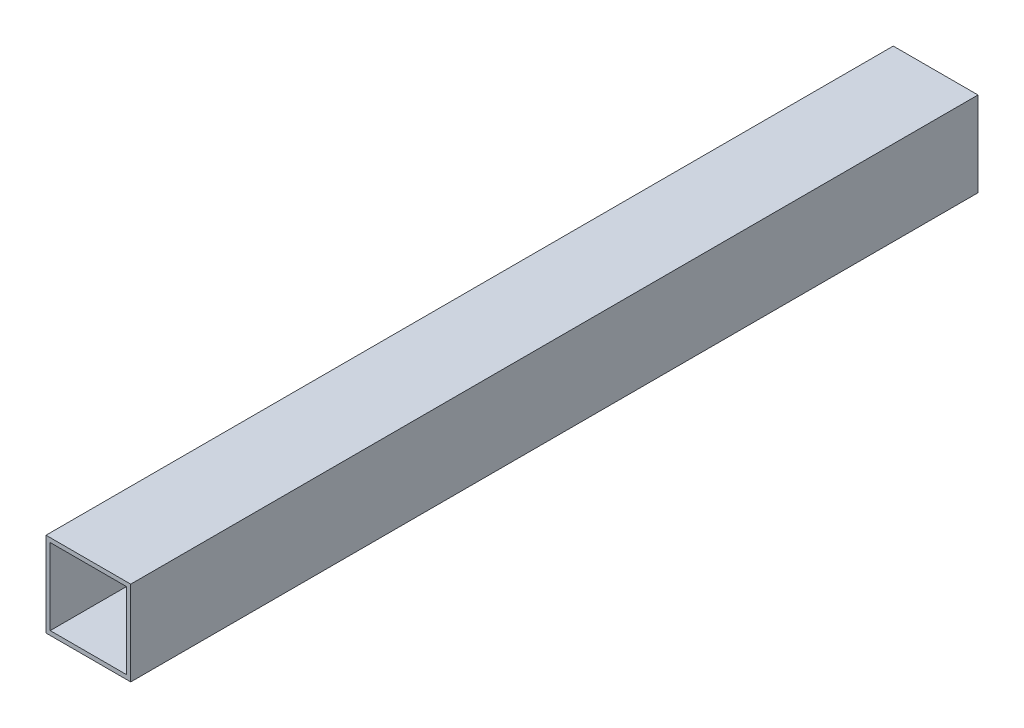
ISO-10303-21;
HEADER;
FILE_DESCRIPTION(('STEP AP214'),'2;1');
FILE_NAME('part.step','',(''),(''),'','','');
FILE_SCHEMA(('AUTOMOTIVE_DESIGN { 1 0 10303 214 1 1 1 1 }'));
ENDSEC;
DATA;
#1=APPLICATION_CONTEXT('core data for automotive mechanical design processes');
#2=APPLICATION_PROTOCOL_DEFINITION('international standard','automotive_design',2000,#1);
#3=PRODUCT_CONTEXT('',#1,'mechanical');
#4=PRODUCT('Part','Part','',(#3));
#5=PRODUCT_RELATED_PRODUCT_CATEGORY('part','',(#4));
#6=PRODUCT_DEFINITION_FORMATION('','',#4);
#7=PRODUCT_DEFINITION_CONTEXT('part definition',#1,'design');
#8=PRODUCT_DEFINITION('design','',#6,#7);
#9=PRODUCT_DEFINITION_SHAPE('','',#8);
#10=(LENGTH_UNIT() NAMED_UNIT(*) SI_UNIT(.MILLI.,.METRE.));
#11=(NAMED_UNIT(*) PLANE_ANGLE_UNIT() SI_UNIT($,.RADIAN.));
#12=(NAMED_UNIT(*) SI_UNIT($,.STERADIAN.) SOLID_ANGLE_UNIT());
#13=UNCERTAINTY_MEASURE_WITH_UNIT(LENGTH_MEASURE(1.E-05),#10,'distance_accuracy_value','');
#14=(GEOMETRIC_REPRESENTATION_CONTEXT(3) GLOBAL_UNCERTAINTY_ASSIGNED_CONTEXT((#13)) GLOBAL_UNIT_ASSIGNED_CONTEXT((#10,
#11,#12)) REPRESENTATION_CONTEXT('',''));
#15=CARTESIAN_POINT('',(0.,0.,0.));
#16=DIRECTION('',(0.,0.,1.));
#17=DIRECTION('',(1.,0.,0.));
#18=AXIS2_PLACEMENT_3D('',#15,#16,#17);
#19=CARTESIAN_POINT('',(0.,0.,10000.));
#20=DIRECTION('',(0.,0.,-1.));
#21=DIRECTION('',(-1.,0.,0.));
#22=AXIS2_PLACEMENT_3D('',#19,#20,#21);
#23=PLANE('',#22);
#24=DIRECTION('',(0.,1.,0.));
#25=VECTOR('',#24,1.);
#26=CARTESIAN_POINT('',(500.,-500.,10000.));
#27=LINE('',#26,#25);
#28=CARTESIAN_POINT('',(500.,-500.,10000.));
#29=VERTEX_POINT('',#28);
#30=CARTESIAN_POINT('',(500.,500.,10000.));
#31=VERTEX_POINT('',#30);
#32=EDGE_CURVE('E134',#29,#31,#27,.T.);
#33=ORIENTED_EDGE('',*,*,#32,.T.);
#34=DIRECTION('',(-1.,0.,0.));
#35=VECTOR('',#34,1.);
#36=CARTESIAN_POINT('',(-500.,500.,10000.));
#37=LINE('',#36,#35);
#38=CARTESIAN_POINT('',(-500.,500.,10000.));
#39=VERTEX_POINT('',#38);
#40=EDGE_CURVE('E137',#31,#39,#37,.T.);
#41=ORIENTED_EDGE('',*,*,#40,.T.);
#42=DIRECTION('',(0.,-1.,0.));
#43=VECTOR('',#42,1.);
#44=CARTESIAN_POINT('',(-500.,-500.,10000.));
#45=LINE('',#44,#43);
#46=CARTESIAN_POINT('',(-500.,-500.,10000.));
#47=VERTEX_POINT('',#46);
#48=EDGE_CURVE('E140',#39,#47,#45,.T.);
#49=ORIENTED_EDGE('',*,*,#48,.T.);
#50=DIRECTION('',(1.,0.,0.));
#51=VECTOR('',#50,1.);
#52=CARTESIAN_POINT('',(-500.,-500.,10000.));
#53=LINE('',#52,#51);
#54=EDGE_CURVE('E142',#47,#29,#53,.T.);
#55=ORIENTED_EDGE('',*,*,#54,.T.);
#56=EDGE_LOOP('',(#33,#41,#49,#55));
#57=FACE_BOUND('',#56,.T.);
#58=DIRECTION('',(0.,-1.,0.));
#59=VECTOR('',#58,1.);
#60=CARTESIAN_POINT('',(-450.,-450.,10000.));
#61=LINE('',#60,#59);
#62=CARTESIAN_POINT('',(-450.,450.,10000.));
#63=VERTEX_POINT('',#62);
#64=CARTESIAN_POINT('',(-450.,-450.,10000.));
#65=VERTEX_POINT('',#64);
#66=EDGE_CURVE('E98',#63,#65,#61,.T.);
#67=ORIENTED_EDGE('',*,*,#66,.F.);
#68=DIRECTION('',(-1.,0.,0.));
#69=VECTOR('',#68,1.);
#70=CARTESIAN_POINT('',(-450.,450.,10000.));
#71=LINE('',#70,#69);
#72=CARTESIAN_POINT('',(450.,450.,10000.));
#73=VERTEX_POINT('',#72);
#74=EDGE_CURVE('E120',#73,#63,#71,.T.);
#75=ORIENTED_EDGE('',*,*,#74,.F.);
#76=DIRECTION('',(0.,1.,0.));
#77=VECTOR('',#76,1.);
#78=CARTESIAN_POINT('',(450.,-450.,10000.));
#79=LINE('',#78,#77);
#80=CARTESIAN_POINT('',(450.,-450.,10000.));
#81=VERTEX_POINT('',#80);
#82=EDGE_CURVE('E118',#81,#73,#79,.T.);
#83=ORIENTED_EDGE('',*,*,#82,.F.);
#84=DIRECTION('',(1.,0.,0.));
#85=VECTOR('',#84,1.);
#86=CARTESIAN_POINT('',(-450.,-450.,10000.));
#87=LINE('',#86,#85);
#88=EDGE_CURVE('E106',#65,#81,#87,.T.);
#89=ORIENTED_EDGE('',*,*,#88,.F.);
#90=EDGE_LOOP('',(#67,#75,#83,#89));
#91=FACE_BOUND('',#90,.T.);
#92=ADVANCED_FACE('F33',(#57,#91),#23,.F.);
#93=CARTESIAN_POINT('',(0.,0.,0.));
#94=DIRECTION('',(0.,0.,-1.));
#95=DIRECTION('',(-1.,0.,0.));
#96=AXIS2_PLACEMENT_3D('',#93,#94,#95);
#97=PLANE('',#96);
#98=DIRECTION('',(0.,1.,0.));
#99=VECTOR('',#98,1.);
#100=CARTESIAN_POINT('',(500.,-500.,0.));
#101=LINE('',#100,#99);
#102=CARTESIAN_POINT('',(500.,-500.,0.));
#103=VERTEX_POINT('',#102);
#104=CARTESIAN_POINT('',(500.,500.,0.));
#105=VERTEX_POINT('',#104);
#106=EDGE_CURVE('E114',#103,#105,#101,.T.);
#107=ORIENTED_EDGE('',*,*,#106,.F.);
#108=DIRECTION('',(1.,0.,0.));
#109=VECTOR('',#108,1.);
#110=CARTESIAN_POINT('',(-500.,-500.,0.));
#111=LINE('',#110,#109);
#112=CARTESIAN_POINT('',(-500.,-500.,0.));
#113=VERTEX_POINT('',#112);
#114=EDGE_CURVE('E138',#113,#103,#111,.T.);
#115=ORIENTED_EDGE('',*,*,#114,.F.);
#116=DIRECTION('',(0.,-1.,0.));
#117=VECTOR('',#116,1.);
#118=CARTESIAN_POINT('',(-500.,-500.,0.));
#119=LINE('',#118,#117);
#120=CARTESIAN_POINT('',(-500.,500.,0.));
#121=VERTEX_POINT('',#120);
#122=EDGE_CURVE('E149',#121,#113,#119,.T.);
#123=ORIENTED_EDGE('',*,*,#122,.F.);
#124=DIRECTION('',(-1.,0.,0.));
#125=VECTOR('',#124,1.);
#126=CARTESIAN_POINT('',(-500.,500.,0.));
#127=LINE('',#126,#125);
#128=EDGE_CURVE('E147',#105,#121,#127,.T.);
#129=ORIENTED_EDGE('',*,*,#128,.F.);
#130=EDGE_LOOP('',(#107,#115,#123,#129));
#131=FACE_BOUND('',#130,.T.);
#132=DIRECTION('',(-1.,0.,0.));
#133=VECTOR('',#132,1.);
#134=CARTESIAN_POINT('',(-450.,450.,0.));
#135=LINE('',#134,#133);
#136=CARTESIAN_POINT('',(450.,450.,0.));
#137=VERTEX_POINT('',#136);
#138=CARTESIAN_POINT('',(-450.,450.,0.));
#139=VERTEX_POINT('',#138);
#140=EDGE_CURVE('E107',#137,#139,#135,.T.);
#141=ORIENTED_EDGE('',*,*,#140,.T.);
#142=DIRECTION('',(0.,-1.,0.));
#143=VECTOR('',#142,1.);
#144=CARTESIAN_POINT('',(-450.,-450.,0.));
#145=LINE('',#144,#143);
#146=CARTESIAN_POINT('',(-450.,-450.,0.));
#147=VERTEX_POINT('',#146);
#148=EDGE_CURVE('E56',#139,#147,#145,.T.);
#149=ORIENTED_EDGE('',*,*,#148,.T.);
#150=DIRECTION('',(1.,0.,0.));
#151=VECTOR('',#150,1.);
#152=CARTESIAN_POINT('',(-450.,-450.,0.));
#153=LINE('',#152,#151);
#154=CARTESIAN_POINT('',(450.,-450.,0.));
#155=VERTEX_POINT('',#154);
#156=EDGE_CURVE('E113',#147,#155,#153,.T.);
#157=ORIENTED_EDGE('',*,*,#156,.T.);
#158=DIRECTION('',(0.,1.,0.));
#159=VECTOR('',#158,1.);
#160=CARTESIAN_POINT('',(450.,-450.,0.));
#161=LINE('',#160,#159);
#162=EDGE_CURVE('E126',#155,#137,#161,.T.);
#163=ORIENTED_EDGE('',*,*,#162,.T.);
#164=EDGE_LOOP('',(#141,#149,#157,#163));
#165=FACE_BOUND('',#164,.T.);
#166=ADVANCED_FACE('F167',(#131,#165),#97,.T.);
#167=CARTESIAN_POINT('',(500.,-500.,10000.));
#168=DIRECTION('',(-1.,0.,0.));
#169=DIRECTION('',(0.,0.,1.));
#170=AXIS2_PLACEMENT_3D('',#167,#168,#169);
#171=PLANE('',#170);
#172=ORIENTED_EDGE('',*,*,#106,.T.);
#173=DIRECTION('',(0.,0.,-1.));
#174=VECTOR('',#173,1.);
#175=CARTESIAN_POINT('',(500.,500.,10000.));
#176=LINE('',#175,#174);
#177=EDGE_CURVE('E11',#31,#105,#176,.T.);
#178=ORIENTED_EDGE('',*,*,#177,.F.);
#179=ORIENTED_EDGE('',*,*,#32,.F.);
#180=DIRECTION('',(0.,0.,-1.));
#181=VECTOR('',#180,1.);
#182=CARTESIAN_POINT('',(500.,-500.,10000.));
#183=LINE('',#182,#181);
#184=EDGE_CURVE('E144',#29,#103,#183,.T.);
#185=ORIENTED_EDGE('',*,*,#184,.T.);
#186=EDGE_LOOP('',(#172,#178,#179,#185));
#187=FACE_BOUND('',#186,.T.);
#188=ADVANCED_FACE('F35',(#187),#171,.F.);
#189=CARTESIAN_POINT('',(-500.,500.,10000.));
#190=DIRECTION('',(0.,-1.,0.));
#191=DIRECTION('',(0.,0.,-1.));
#192=AXIS2_PLACEMENT_3D('',#189,#190,#191);
#193=PLANE('',#192);
#194=ORIENTED_EDGE('',*,*,#128,.T.);
#195=DIRECTION('',(0.,0.,-1.));
#196=VECTOR('',#195,1.);
#197=CARTESIAN_POINT('',(-500.,500.,10000.));
#198=LINE('',#197,#196);
#199=EDGE_CURVE('E41',#39,#121,#198,.T.);
#200=ORIENTED_EDGE('',*,*,#199,.F.);
#201=ORIENTED_EDGE('',*,*,#40,.F.);
#202=ORIENTED_EDGE('',*,*,#177,.T.);
#203=EDGE_LOOP('',(#194,#200,#201,#202));
#204=FACE_BOUND('',#203,.T.);
#205=ADVANCED_FACE('F177',(#204),#193,.F.);
#206=CARTESIAN_POINT('',(-500.,-500.,10000.));
#207=DIRECTION('',(1.,0.,0.));
#208=DIRECTION('',(0.,0.,-1.));
#209=AXIS2_PLACEMENT_3D('',#206,#207,#208);
#210=PLANE('',#209);
#211=ORIENTED_EDGE('',*,*,#122,.T.);
#212=DIRECTION('',(0.,0.,-1.));
#213=VECTOR('',#212,1.);
#214=CARTESIAN_POINT('',(-500.,-500.,10000.));
#215=LINE('',#214,#213);
#216=EDGE_CURVE('E154',#47,#113,#215,.T.);
#217=ORIENTED_EDGE('',*,*,#216,.F.);
#218=ORIENTED_EDGE('',*,*,#48,.F.);
#219=ORIENTED_EDGE('',*,*,#199,.T.);
#220=EDGE_LOOP('',(#211,#217,#218,#219));
#221=FACE_BOUND('',#220,.T.);
#222=ADVANCED_FACE('F161',(#221),#210,.F.);
#223=CARTESIAN_POINT('',(-500.,-500.,10000.));
#224=DIRECTION('',(0.,1.,0.));
#225=DIRECTION('',(0.,0.,1.));
#226=AXIS2_PLACEMENT_3D('',#223,#224,#225);
#227=PLANE('',#226);
#228=ORIENTED_EDGE('',*,*,#114,.T.);
#229=ORIENTED_EDGE('',*,*,#184,.F.);
#230=ORIENTED_EDGE('',*,*,#54,.F.);
#231=ORIENTED_EDGE('',*,*,#216,.T.);
#232=EDGE_LOOP('',(#228,#229,#230,#231));
#233=FACE_BOUND('',#232,.T.);
#234=ADVANCED_FACE('F171',(#233),#227,.F.);
#235=CARTESIAN_POINT('',(-450.,-450.,10000.));
#236=DIRECTION('',(1.,0.,0.));
#237=DIRECTION('',(0.,0.,-1.));
#238=AXIS2_PLACEMENT_3D('',#235,#236,#237);
#239=PLANE('',#238);
#240=ORIENTED_EDGE('',*,*,#148,.F.);
#241=DIRECTION('',(0.,0.,-1.));
#242=VECTOR('',#241,1.);
#243=CARTESIAN_POINT('',(-450.,450.,10000.));
#244=LINE('',#243,#242);
#245=EDGE_CURVE('E102',#63,#139,#244,.T.);
#246=ORIENTED_EDGE('',*,*,#245,.F.);
#247=ORIENTED_EDGE('',*,*,#66,.T.);
#248=DIRECTION('',(0.,0.,-1.));
#249=VECTOR('',#248,1.);
#250=CARTESIAN_POINT('',(-450.,-450.,10000.));
#251=LINE('',#250,#249);
#252=EDGE_CURVE('E101',#65,#147,#251,.T.);
#253=ORIENTED_EDGE('',*,*,#252,.T.);
#254=EDGE_LOOP('',(#240,#246,#247,#253));
#255=FACE_BOUND('',#254,.T.);
#256=ADVANCED_FACE('F100',(#255),#239,.T.);
#257=CARTESIAN_POINT('',(-450.,-450.,10000.));
#258=DIRECTION('',(0.,1.,0.));
#259=DIRECTION('',(0.,0.,1.));
#260=AXIS2_PLACEMENT_3D('',#257,#258,#259);
#261=PLANE('',#260);
#262=ORIENTED_EDGE('',*,*,#156,.F.);
#263=ORIENTED_EDGE('',*,*,#252,.F.);
#264=ORIENTED_EDGE('',*,*,#88,.T.);
#265=DIRECTION('',(0.,0.,-1.));
#266=VECTOR('',#265,1.);
#267=CARTESIAN_POINT('',(450.,-450.,10000.));
#268=LINE('',#267,#266);
#269=EDGE_CURVE('E115',#81,#155,#268,.T.);
#270=ORIENTED_EDGE('',*,*,#269,.T.);
#271=EDGE_LOOP('',(#262,#263,#264,#270));
#272=FACE_BOUND('',#271,.T.);
#273=ADVANCED_FACE('F110',(#272),#261,.T.);
#274=CARTESIAN_POINT('',(450.,-450.,10000.));
#275=DIRECTION('',(-1.,0.,0.));
#276=DIRECTION('',(0.,-1.,0.));
#277=AXIS2_PLACEMENT_3D('',#274,#275,#276);
#278=PLANE('',#277);
#279=ORIENTED_EDGE('',*,*,#162,.F.);
#280=ORIENTED_EDGE('',*,*,#269,.F.);
#281=ORIENTED_EDGE('',*,*,#82,.T.);
#282=DIRECTION('',(0.,0.,-1.));
#283=VECTOR('',#282,1.);
#284=CARTESIAN_POINT('',(450.,450.,10000.));
#285=LINE('',#284,#283);
#286=EDGE_CURVE('E48',#73,#137,#285,.T.);
#287=ORIENTED_EDGE('',*,*,#286,.T.);
#288=EDGE_LOOP('',(#279,#280,#281,#287));
#289=FACE_BOUND('',#288,.T.);
#290=ADVANCED_FACE('F200',(#289),#278,.T.);
#291=CARTESIAN_POINT('',(-450.,450.,10000.));
#292=DIRECTION('',(0.,-1.,0.));
#293=DIRECTION('',(1.,0.,0.));
#294=AXIS2_PLACEMENT_3D('',#291,#292,#293);
#295=PLANE('',#294);
#296=ORIENTED_EDGE('',*,*,#140,.F.);
#297=ORIENTED_EDGE('',*,*,#286,.F.);
#298=ORIENTED_EDGE('',*,*,#74,.T.);
#299=ORIENTED_EDGE('',*,*,#245,.T.);
#300=EDGE_LOOP('',(#296,#297,#298,#299));
#301=FACE_BOUND('',#300,.T.);
#302=ADVANCED_FACE('F204',(#301),#295,.T.);
#303=CLOSED_SHELL('',(#92,#166,#188,#205,#222,#234,#256,#273,#290,#302));
#304=MANIFOLD_SOLID_BREP('B2',#303);
#305=ADVANCED_BREP_SHAPE_REPRESENTATION('',(#18,#304),#14);
#306=SHAPE_DEFINITION_REPRESENTATION(#9,#305);
ENDSEC;
END-ISO-10303-21;
